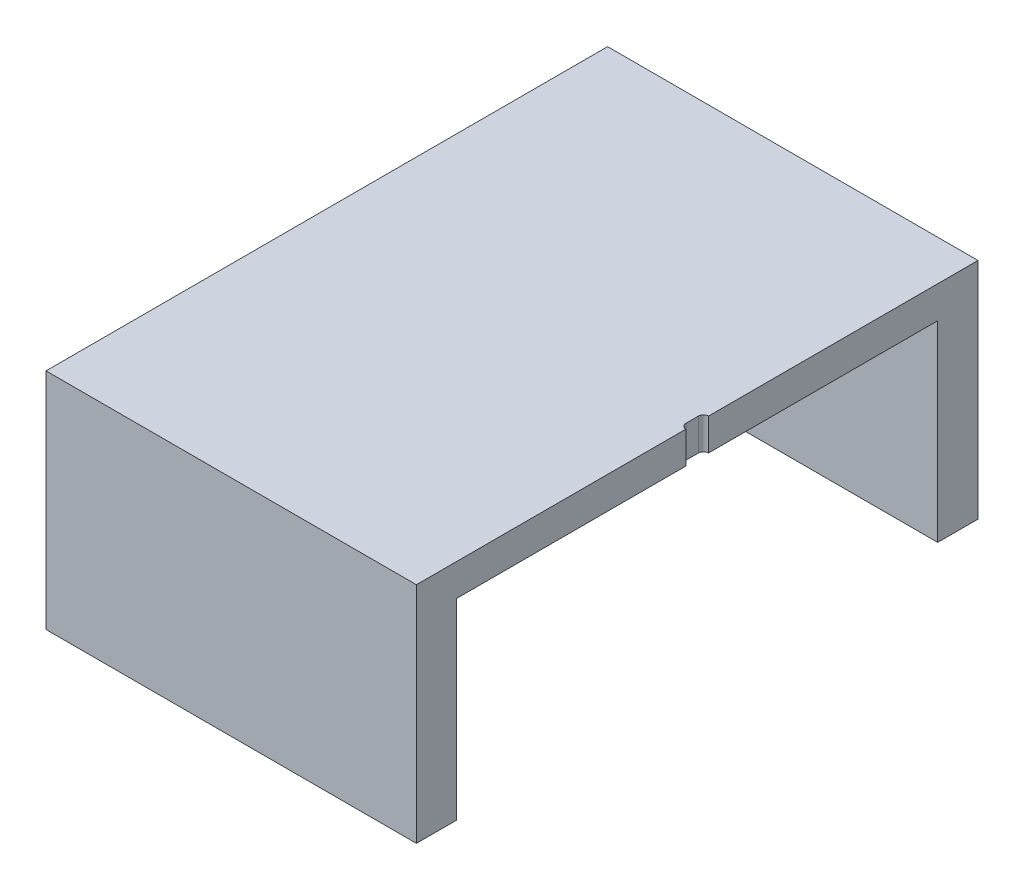
ISO-10303-21;
HEADER;
FILE_DESCRIPTION(('STEP AP214'),'2;1');
FILE_NAME('part.step','',(''),(''),'','','');
FILE_SCHEMA(('AUTOMOTIVE_DESIGN { 1 0 10303 214 1 1 1 1 }'));
ENDSEC;
DATA;
#1=APPLICATION_CONTEXT('core data for automotive mechanical design processes');
#2=APPLICATION_PROTOCOL_DEFINITION('international standard','automotive_design',2000,#1);
#3=PRODUCT_CONTEXT('',#1,'mechanical');
#4=PRODUCT('Part','Part','',(#3));
#5=PRODUCT_RELATED_PRODUCT_CATEGORY('part','',(#4));
#6=PRODUCT_DEFINITION_FORMATION('','',#4);
#7=PRODUCT_DEFINITION_CONTEXT('part definition',#1,'design');
#8=PRODUCT_DEFINITION('design','',#6,#7);
#9=PRODUCT_DEFINITION_SHAPE('','',#8);
#10=(LENGTH_UNIT() NAMED_UNIT(*) SI_UNIT(.MILLI.,.METRE.));
#11=(NAMED_UNIT(*) PLANE_ANGLE_UNIT() SI_UNIT($,.RADIAN.));
#12=(NAMED_UNIT(*) SI_UNIT($,.STERADIAN.) SOLID_ANGLE_UNIT());
#13=UNCERTAINTY_MEASURE_WITH_UNIT(LENGTH_MEASURE(1.E-05),#10,'distance_accuracy_value','');
#14=(GEOMETRIC_REPRESENTATION_CONTEXT(3) GLOBAL_UNCERTAINTY_ASSIGNED_CONTEXT((#13)) GLOBAL_UNIT_ASSIGNED_CONTEXT((#10,
#11,#12)) REPRESENTATION_CONTEXT('',''));
#15=CARTESIAN_POINT('',(0.,0.,0.));
#16=DIRECTION('',(0.,0.,1.));
#17=DIRECTION('',(1.,0.,0.));
#18=AXIS2_PLACEMENT_3D('',#15,#16,#17);
#19=CARTESIAN_POINT('',(0.,19.05,51.72));
#20=DIRECTION('',(0.,0.,-1.));
#21=DIRECTION('',(-1.,0.,0.));
#22=AXIS2_PLACEMENT_3D('',#19,#20,#21);
#23=PLANE('',#22);
#24=DIRECTION('',(1.,0.,0.));
#25=VECTOR('',#24,1.);
#26=CARTESIAN_POINT('',(0.,0.,51.72));
#27=LINE('',#26,#25);
#28=CARTESIAN_POINT('',(-32.75,0.,51.72));
#29=VERTEX_POINT('',#28);
#30=CARTESIAN_POINT('',(0.,0.,51.72));
#31=VERTEX_POINT('',#30);
#32=EDGE_CURVE('E116',#29,#31,#27,.T.);
#33=ORIENTED_EDGE('',*,*,#32,.F.);
#34=DIRECTION('',(0.,-1.,0.));
#35=VECTOR('',#34,1.);
#36=CARTESIAN_POINT('',(-32.75,19.05,51.72));
#37=LINE('',#36,#35);
#38=CARTESIAN_POINT('',(-32.75,19.05,51.72));
#39=VERTEX_POINT('',#38);
#40=EDGE_CURVE('E11',#39,#29,#37,.T.);
#41=ORIENTED_EDGE('',*,*,#40,.F.);
#42=DIRECTION('',(1.,0.,0.));
#43=VECTOR('',#42,1.);
#44=CARTESIAN_POINT('',(0.,19.05,51.72));
#45=LINE('',#44,#43);
#46=CARTESIAN_POINT('',(0.,19.05,51.72));
#47=VERTEX_POINT('',#46);
#48=EDGE_CURVE('E117',#39,#47,#45,.T.);
#49=ORIENTED_EDGE('',*,*,#48,.T.);
#50=DIRECTION('',(0.,-1.,0.));
#51=VECTOR('',#50,1.);
#52=CARTESIAN_POINT('',(0.,19.05,51.72));
#53=LINE('',#52,#51);
#54=EDGE_CURVE('E101',#47,#31,#53,.T.);
#55=ORIENTED_EDGE('',*,*,#54,.T.);
#56=EDGE_LOOP('',(#33,#41,#49,#55));
#57=FACE_BOUND('',#56,.T.);
#58=ADVANCED_FACE('F43',(#57),#23,.T.);
#59=CARTESIAN_POINT('',(-32.75,19.05,0.));
#60=DIRECTION('',(1.,0.,0.));
#61=DIRECTION('',(0.,0.,-1.));
#62=AXIS2_PLACEMENT_3D('',#59,#60,#61);
#63=PLANE('',#62);
#64=DIRECTION('',(0.,0.,1.));
#65=VECTOR('',#64,1.);
#66=CARTESIAN_POINT('',(-32.75,0.,0.));
#67=LINE('',#66,#65);
#68=CARTESIAN_POINT('',(-32.75,0.,4.));
#69=VERTEX_POINT('',#68);
#70=EDGE_CURVE('E130',#69,#29,#67,.T.);
#71=ORIENTED_EDGE('',*,*,#70,.F.);
#72=DIRECTION('',(0.,-1.,0.));
#73=VECTOR('',#72,1.);
#74=CARTESIAN_POINT('',(-32.75,19.05,4.));
#75=LINE('',#74,#73);
#76=CARTESIAN_POINT('',(-32.75,19.05,4.));
#77=VERTEX_POINT('',#76);
#78=EDGE_CURVE('E51',#77,#69,#75,.T.);
#79=ORIENTED_EDGE('',*,*,#78,.F.);
#80=DIRECTION('',(0.,0.,1.));
#81=VECTOR('',#80,1.);
#82=CARTESIAN_POINT('',(-32.75,19.05,0.));
#83=LINE('',#82,#81);
#84=EDGE_CURVE('E58',#77,#39,#83,.T.);
#85=ORIENTED_EDGE('',*,*,#84,.T.);
#86=ORIENTED_EDGE('',*,*,#40,.T.);
#87=EDGE_LOOP('',(#71,#79,#85,#86));
#88=FACE_BOUND('',#87,.T.);
#89=ADVANCED_FACE('F242',(#88),#63,.T.);
#90=CARTESIAN_POINT('',(0.,19.05,4.));
#91=DIRECTION('',(0.,0.,1.));
#92=DIRECTION('',(1.,0.,0.));
#93=AXIS2_PLACEMENT_3D('',#90,#91,#92);
#94=PLANE('',#93);
#95=DIRECTION('',(-1.,0.,0.));
#96=VECTOR('',#95,1.);
#97=CARTESIAN_POINT('',(0.,0.,4.));
#98=LINE('',#97,#96);
#99=CARTESIAN_POINT('',(0.,0.,4.));
#100=VERTEX_POINT('',#99);
#101=EDGE_CURVE('E126',#100,#69,#98,.T.);
#102=ORIENTED_EDGE('',*,*,#101,.F.);
#103=DIRECTION('',(0.,-1.,0.));
#104=VECTOR('',#103,1.);
#105=CARTESIAN_POINT('',(0.,19.05,4.));
#106=LINE('',#105,#104);
#107=CARTESIAN_POINT('',(0.,19.05,4.));
#108=VERTEX_POINT('',#107);
#109=EDGE_CURVE('E539',#108,#100,#106,.T.);
#110=ORIENTED_EDGE('',*,*,#109,.F.);
#111=DIRECTION('',(-1.,0.,0.));
#112=VECTOR('',#111,1.);
#113=CARTESIAN_POINT('',(0.,19.05,4.));
#114=LINE('',#113,#112);
#115=EDGE_CURVE('E136',#108,#77,#114,.T.);
#116=ORIENTED_EDGE('',*,*,#115,.T.);
#117=ORIENTED_EDGE('',*,*,#78,.T.);
#118=EDGE_LOOP('',(#102,#110,#116,#117));
#119=FACE_BOUND('',#118,.T.);
#120=ADVANCED_FACE('F247',(#119),#94,.T.);
#121=CARTESIAN_POINT('',(0.,19.05,0.));
#122=DIRECTION('',(1.,0.,0.));
#123=DIRECTION('',(0.,0.,-1.));
#124=AXIS2_PLACEMENT_3D('',#121,#122,#123);
#125=PLANE('',#124);
#126=DIRECTION('',(0.,0.,1.));
#127=VECTOR('',#126,1.);
#128=CARTESIAN_POINT('',(0.,0.,0.));
#129=LINE('',#128,#127);
#130=CARTESIAN_POINT('',(0.,0.,0.));
#131=VERTEX_POINT('',#130);
#132=EDGE_CURVE('E119',#131,#100,#129,.T.);
#133=ORIENTED_EDGE('',*,*,#132,.F.);
#134=DIRECTION('',(0.,-1.,0.));
#135=VECTOR('',#134,1.);
#136=CARTESIAN_POINT('',(0.,19.05,0.));
#137=LINE('',#136,#135);
#138=CARTESIAN_POINT('',(0.,22.225,0.));
#139=VERTEX_POINT('',#138);
#140=EDGE_CURVE('E540',#139,#131,#137,.T.);
#141=ORIENTED_EDGE('',*,*,#140,.F.);
#142=DIRECTION('',(0.,0.,-1.));
#143=VECTOR('',#142,1.);
#144=CARTESIAN_POINT('',(0.,22.225,0.));
#145=LINE('',#144,#143);
#146=CARTESIAN_POINT('',(0.,22.225,26.735));
#147=VERTEX_POINT('',#146);
#148=EDGE_CURVE('E155',#147,#139,#145,.T.);
#149=ORIENTED_EDGE('',*,*,#148,.F.);
#150=DIRECTION('',(0.,-1.,0.));
#151=VECTOR('',#150,1.);
#152=CARTESIAN_POINT('',(0.,22.225,26.735));
#153=LINE('',#152,#151);
#154=CARTESIAN_POINT('',(0.,19.05,26.735));
#155=VERTEX_POINT('',#154);
#156=EDGE_CURVE('E148',#147,#155,#153,.T.);
#157=ORIENTED_EDGE('',*,*,#156,.T.);
#158=DIRECTION('',(0.,0.,-1.));
#159=VECTOR('',#158,1.);
#160=CARTESIAN_POINT('',(0.,19.05,0.));
#161=LINE('',#160,#159);
#162=EDGE_CURVE('E165',#155,#108,#161,.T.);
#163=ORIENTED_EDGE('',*,*,#162,.T.);
#164=ORIENTED_EDGE('',*,*,#109,.T.);
#165=EDGE_LOOP('',(#133,#141,#149,#157,#163,#164));
#166=FACE_BOUND('',#165,.T.);
#167=ADVANCED_FACE('F470',(#166),#125,.T.);
#168=CARTESIAN_POINT('',(0.,19.05,0.));
#169=DIRECTION('',(0.,0.,1.));
#170=DIRECTION('',(1.,0.,0.));
#171=AXIS2_PLACEMENT_3D('',#168,#169,#170);
#172=PLANE('',#171);
#173=DIRECTION('',(-1.,0.,0.));
#174=VECTOR('',#173,1.);
#175=CARTESIAN_POINT('',(0.,0.,0.));
#176=LINE('',#175,#174);
#177=CARTESIAN_POINT('',(-36.75,0.,0.));
#178=VERTEX_POINT('',#177);
#179=EDGE_CURVE('E125',#131,#178,#176,.T.);
#180=ORIENTED_EDGE('',*,*,#179,.T.);
#181=DIRECTION('',(0.,-1.,0.));
#182=VECTOR('',#181,1.);
#183=CARTESIAN_POINT('',(-36.75,19.05,0.));
#184=LINE('',#183,#182);
#185=CARTESIAN_POINT('',(-36.75,22.225,0.));
#186=VERTEX_POINT('',#185);
#187=EDGE_CURVE('E544',#186,#178,#184,.T.);
#188=ORIENTED_EDGE('',*,*,#187,.F.);
#189=DIRECTION('',(1.,0.,0.));
#190=VECTOR('',#189,1.);
#191=CARTESIAN_POINT('',(0.,22.225,0.));
#192=LINE('',#191,#190);
#193=EDGE_CURVE('E183',#186,#139,#192,.T.);
#194=ORIENTED_EDGE('',*,*,#193,.T.);
#195=ORIENTED_EDGE('',*,*,#140,.T.);
#196=EDGE_LOOP('',(#180,#188,#194,#195));
#197=FACE_BOUND('',#196,.T.);
#198=ADVANCED_FACE('F490',(#197),#172,.F.);
#199=CARTESIAN_POINT('',(-36.75,19.05,0.));
#200=DIRECTION('',(1.,0.,0.));
#201=DIRECTION('',(0.,0.,-1.));
#202=AXIS2_PLACEMENT_3D('',#199,#200,#201);
#203=PLANE('',#202);
#204=DIRECTION('',(0.,0.,1.));
#205=VECTOR('',#204,1.);
#206=CARTESIAN_POINT('',(-36.75,0.,0.));
#207=LINE('',#206,#205);
#208=CARTESIAN_POINT('',(-36.75,0.,55.72));
#209=VERTEX_POINT('',#208);
#210=EDGE_CURVE('E110',#178,#209,#207,.T.);
#211=ORIENTED_EDGE('',*,*,#210,.T.);
#212=DIRECTION('',(0.,-1.,0.));
#213=VECTOR('',#212,1.);
#214=CARTESIAN_POINT('',(-36.75,19.05,55.72));
#215=LINE('',#214,#213);
#216=CARTESIAN_POINT('',(-36.75,22.225,55.72));
#217=VERTEX_POINT('',#216);
#218=EDGE_CURVE('E100',#217,#209,#215,.T.);
#219=ORIENTED_EDGE('',*,*,#218,.F.);
#220=DIRECTION('',(0.,0.,-1.));
#221=VECTOR('',#220,1.);
#222=CARTESIAN_POINT('',(-36.75,22.225,0.));
#223=LINE('',#222,#221);
#224=EDGE_CURVE('E180',#217,#186,#223,.T.);
#225=ORIENTED_EDGE('',*,*,#224,.T.);
#226=ORIENTED_EDGE('',*,*,#187,.T.);
#227=EDGE_LOOP('',(#211,#219,#225,#226));
#228=FACE_BOUND('',#227,.T.);
#229=ADVANCED_FACE('F479',(#228),#203,.F.);
#230=CARTESIAN_POINT('',(0.,19.05,55.72));
#231=DIRECTION('',(0.,0.,1.));
#232=DIRECTION('',(1.,0.,0.));
#233=AXIS2_PLACEMENT_3D('',#230,#231,#232);
#234=PLANE('',#233);
#235=DIRECTION('',(-1.,0.,0.));
#236=VECTOR('',#235,1.);
#237=CARTESIAN_POINT('',(0.,0.,55.72));
#238=LINE('',#237,#236);
#239=CARTESIAN_POINT('',(0.,0.,55.72));
#240=VERTEX_POINT('',#239);
#241=EDGE_CURVE('E104',#240,#209,#238,.T.);
#242=ORIENTED_EDGE('',*,*,#241,.F.);
#243=DIRECTION('',(0.,-1.,0.));
#244=VECTOR('',#243,1.);
#245=CARTESIAN_POINT('',(0.,19.05,55.72));
#246=LINE('',#245,#244);
#247=CARTESIAN_POINT('',(0.,22.225,55.72));
#248=VERTEX_POINT('',#247);
#249=EDGE_CURVE('E87',#248,#240,#246,.T.);
#250=ORIENTED_EDGE('',*,*,#249,.F.);
#251=DIRECTION('',(1.,0.,0.));
#252=VECTOR('',#251,1.);
#253=CARTESIAN_POINT('',(0.,22.225,55.72));
#254=LINE('',#253,#252);
#255=EDGE_CURVE('E178',#217,#248,#254,.T.);
#256=ORIENTED_EDGE('',*,*,#255,.F.);
#257=ORIENTED_EDGE('',*,*,#218,.T.);
#258=EDGE_LOOP('',(#242,#250,#256,#257));
#259=FACE_BOUND('',#258,.T.);
#260=ADVANCED_FACE('F105',(#259),#234,.T.);
#261=EDGE_CURVE('E92',#31,#240,#129,.T.);
#262=ORIENTED_EDGE('',*,*,#261,.F.);
#263=ORIENTED_EDGE('',*,*,#54,.F.);
#264=DIRECTION('',(0.,0.,-1.));
#265=VECTOR('',#264,1.);
#266=CARTESIAN_POINT('',(0.,19.05,0.));
#267=LINE('',#266,#265);
#268=CARTESIAN_POINT('',(0.,19.05,28.985));
#269=VERTEX_POINT('',#268);
#270=EDGE_CURVE('E162',#47,#269,#267,.T.);
#271=ORIENTED_EDGE('',*,*,#270,.T.);
#272=DIRECTION('',(0.,-1.,0.));
#273=VECTOR('',#272,1.);
#274=CARTESIAN_POINT('',(0.,22.225,28.985));
#275=LINE('',#274,#273);
#276=CARTESIAN_POINT('',(0.,22.225,28.985));
#277=VERTEX_POINT('',#276);
#278=EDGE_CURVE('E135',#277,#269,#275,.T.);
#279=ORIENTED_EDGE('',*,*,#278,.F.);
#280=DIRECTION('',(0.,0.,-1.));
#281=VECTOR('',#280,1.);
#282=CARTESIAN_POINT('',(0.,22.225,0.));
#283=LINE('',#282,#281);
#284=EDGE_CURVE('E96',#248,#277,#283,.T.);
#285=ORIENTED_EDGE('',*,*,#284,.F.);
#286=ORIENTED_EDGE('',*,*,#249,.T.);
#287=EDGE_LOOP('',(#262,#263,#271,#279,#285,#286));
#288=FACE_BOUND('',#287,.T.);
#289=ADVANCED_FACE('F89',(#288),#125,.T.);
#290=CARTESIAN_POINT('',(0.,0.,0.));
#291=DIRECTION('',(0.,1.,0.));
#292=DIRECTION('',(0.,0.,1.));
#293=AXIS2_PLACEMENT_3D('',#290,#291,#292);
#294=PLANE('',#293);
#295=CARTESIAN_POINT('',(-9.99999999999999,0.,53.22));
#296=DIRECTION('',(0.,-1.,0.));
#297=DIRECTION('',(0.,0.,-1.));
#298=AXIS2_PLACEMENT_3D('',#295,#296,#297);
#299=CIRCLE('',#298,0.888999999999989);
#300=CARTESIAN_POINT('',(-9.99999999999999,0.,52.331));
#301=VERTEX_POINT('',#300);
#302=EDGE_CURVE('E208',#301,#301,#299,.T.);
#303=ORIENTED_EDGE('',*,*,#302,.F.);
#304=EDGE_LOOP('',(#303));
#305=FACE_BOUND('',#304,.T.);
#306=CARTESIAN_POINT('',(-34.25,0.,53.22));
#307=DIRECTION('',(0.,-1.,0.));
#308=DIRECTION('',(0.,0.,-1.));
#309=AXIS2_PLACEMENT_3D('',#306,#307,#308);
#310=CIRCLE('',#309,0.888999999999987);
#311=CARTESIAN_POINT('',(-34.25,0.,52.331));
#312=VERTEX_POINT('',#311);
#313=EDGE_CURVE('E202',#312,#312,#310,.T.);
#314=ORIENTED_EDGE('',*,*,#313,.F.);
#315=EDGE_LOOP('',(#314));
#316=FACE_BOUND('',#315,.T.);
#317=CARTESIAN_POINT('',(-34.25,0.,2.5));
#318=DIRECTION('',(0.,-1.,0.));
#319=DIRECTION('',(0.,0.,-1.));
#320=AXIS2_PLACEMENT_3D('',#317,#318,#319);
#321=CIRCLE('',#320,0.888999999999987);
#322=CARTESIAN_POINT('',(-34.25,0.,1.61100000000002));
#323=VERTEX_POINT('',#322);
#324=EDGE_CURVE('E196',#323,#323,#321,.T.);
#325=ORIENTED_EDGE('',*,*,#324,.F.);
#326=EDGE_LOOP('',(#325));
#327=FACE_BOUND('',#326,.T.);
#328=CARTESIAN_POINT('',(-10.,0.,2.5));
#329=DIRECTION('',(0.,-1.,0.));
#330=DIRECTION('',(0.,0.,-1.));
#331=AXIS2_PLACEMENT_3D('',#328,#329,#330);
#332=CIRCLE('',#331,0.888999999999989);
#333=CARTESIAN_POINT('',(-10.,0.,1.61100000000002));
#334=VERTEX_POINT('',#333);
#335=EDGE_CURVE('E190',#334,#334,#332,.T.);
#336=ORIENTED_EDGE('',*,*,#335,.F.);
#337=EDGE_LOOP('',(#336));
#338=FACE_BOUND('',#337,.T.);
#339=ORIENTED_EDGE('',*,*,#32,.T.);
#340=ORIENTED_EDGE('',*,*,#261,.T.);
#341=ORIENTED_EDGE('',*,*,#241,.T.);
#342=ORIENTED_EDGE('',*,*,#210,.F.);
#343=ORIENTED_EDGE('',*,*,#179,.F.);
#344=ORIENTED_EDGE('',*,*,#132,.T.);
#345=ORIENTED_EDGE('',*,*,#101,.T.);
#346=ORIENTED_EDGE('',*,*,#70,.T.);
#347=EDGE_LOOP('',(#339,#340,#341,#342,#343,#344,#345,#346));
#348=FACE_BOUND('',#347,.T.);
#349=ADVANCED_FACE('F113',(#305,#316,#327,#338,#348),#294,.F.);
#350=CARTESIAN_POINT('',(0.,22.225,28.485));
#351=DIRECTION('',(0.,-1.,0.));
#352=DIRECTION('',(0.,0.,-1.));
#353=AXIS2_PLACEMENT_3D('',#350,#351,#352);
#354=CYLINDRICAL_SURFACE('',#353,0.499999999999993);
#355=CARTESIAN_POINT('',(0.,19.05,28.485));
#356=DIRECTION('',(0.,1.,0.));
#357=DIRECTION('',(0.,0.,1.));
#358=AXIS2_PLACEMENT_3D('',#355,#356,#357);
#359=CIRCLE('',#358,0.499999999999993);
#360=CARTESIAN_POINT('',(-0.49999999999999,19.05,28.485));
#361=VERTEX_POINT('',#360);
#362=EDGE_CURVE('E159',#361,#269,#359,.T.);
#363=ORIENTED_EDGE('',*,*,#362,.F.);
#364=DIRECTION('',(0.,-1.,0.));
#365=VECTOR('',#364,1.);
#366=CARTESIAN_POINT('',(-0.49999999999999,22.225,28.485));
#367=LINE('',#366,#365);
#368=CARTESIAN_POINT('',(-0.49999999999999,22.225,28.485));
#369=VERTEX_POINT('',#368);
#370=EDGE_CURVE('E142',#369,#361,#367,.T.);
#371=ORIENTED_EDGE('',*,*,#370,.F.);
#372=CARTESIAN_POINT('',(0.,22.225,28.485));
#373=DIRECTION('',(0.,1.,0.));
#374=DIRECTION('',(0.,0.,1.));
#375=AXIS2_PLACEMENT_3D('',#372,#373,#374);
#376=CIRCLE('',#375,0.499999999999993);
#377=EDGE_CURVE('E174',#369,#277,#376,.T.);
#378=ORIENTED_EDGE('',*,*,#377,.T.);
#379=ORIENTED_EDGE('',*,*,#278,.T.);
#380=EDGE_LOOP('',(#363,#371,#378,#379));
#381=FACE_BOUND('',#380,.T.);
#382=ADVANCED_FACE('F216',(#381),#354,.F.);
#383=CARTESIAN_POINT('',(-0.499999999999992,22.225,0.));
#384=DIRECTION('',(-1.,0.,0.));
#385=DIRECTION('',(0.,0.,1.));
#386=AXIS2_PLACEMENT_3D('',#383,#384,#385);
#387=PLANE('',#386);
#388=DIRECTION('',(0.,0.,-1.));
#389=VECTOR('',#388,1.);
#390=CARTESIAN_POINT('',(-0.499999999999992,19.05,0.));
#391=LINE('',#390,#389);
#392=CARTESIAN_POINT('',(-0.499999999999997,19.05,27.235));
#393=VERTEX_POINT('',#392);
#394=EDGE_CURVE('E156',#361,#393,#391,.T.);
#395=ORIENTED_EDGE('',*,*,#394,.T.);
#396=DIRECTION('',(0.,-1.,0.));
#397=VECTOR('',#396,1.);
#398=CARTESIAN_POINT('',(-0.499999999999997,22.225,27.235));
#399=LINE('',#398,#397);
#400=CARTESIAN_POINT('',(-0.499999999999997,22.225,27.235));
#401=VERTEX_POINT('',#400);
#402=EDGE_CURVE('E145',#401,#393,#399,.T.);
#403=ORIENTED_EDGE('',*,*,#402,.F.);
#404=DIRECTION('',(0.,0.,-1.));
#405=VECTOR('',#404,1.);
#406=CARTESIAN_POINT('',(-0.499999999999992,22.225,0.));
#407=LINE('',#406,#405);
#408=EDGE_CURVE('E171',#369,#401,#407,.T.);
#409=ORIENTED_EDGE('',*,*,#408,.F.);
#410=ORIENTED_EDGE('',*,*,#370,.T.);
#411=EDGE_LOOP('',(#395,#403,#409,#410));
#412=FACE_BOUND('',#411,.T.);
#413=ADVANCED_FACE('F399',(#412),#387,.F.);
#414=CARTESIAN_POINT('',(0.,22.225,27.235));
#415=DIRECTION('',(0.,-1.,0.));
#416=DIRECTION('',(0.,0.,-1.));
#417=AXIS2_PLACEMENT_3D('',#414,#415,#416);
#418=CYLINDRICAL_SURFACE('',#417,0.499999999999993);
#419=CARTESIAN_POINT('',(0.,19.05,27.235));
#420=DIRECTION('',(0.,1.,0.));
#421=DIRECTION('',(0.,0.,1.));
#422=AXIS2_PLACEMENT_3D('',#419,#420,#421);
#423=CIRCLE('',#422,0.499999999999993);
#424=EDGE_CURVE('E152',#155,#393,#423,.T.);
#425=ORIENTED_EDGE('',*,*,#424,.F.);
#426=ORIENTED_EDGE('',*,*,#156,.F.);
#427=CARTESIAN_POINT('',(0.,22.225,27.235));
#428=DIRECTION('',(0.,1.,0.));
#429=DIRECTION('',(0.,0.,1.));
#430=AXIS2_PLACEMENT_3D('',#427,#428,#429);
#431=CIRCLE('',#430,0.499999999999993);
#432=EDGE_CURVE('E151',#147,#401,#431,.T.);
#433=ORIENTED_EDGE('',*,*,#432,.T.);
#434=ORIENTED_EDGE('',*,*,#402,.T.);
#435=EDGE_LOOP('',(#425,#426,#433,#434));
#436=FACE_BOUND('',#435,.T.);
#437=ADVANCED_FACE('F407',(#436),#418,.F.);
#438=CARTESIAN_POINT('',(0.,22.225,28.485));
#439=DIRECTION('',(0.,1.,0.));
#440=DIRECTION('',(0.,0.,1.));
#441=AXIS2_PLACEMENT_3D('',#438,#439,#440);
#442=PLANE('',#441);
#443=ORIENTED_EDGE('',*,*,#148,.T.);
#444=ORIENTED_EDGE('',*,*,#193,.F.);
#445=ORIENTED_EDGE('',*,*,#224,.F.);
#446=ORIENTED_EDGE('',*,*,#255,.T.);
#447=ORIENTED_EDGE('',*,*,#284,.T.);
#448=ORIENTED_EDGE('',*,*,#377,.F.);
#449=ORIENTED_EDGE('',*,*,#408,.T.);
#450=ORIENTED_EDGE('',*,*,#432,.F.);
#451=EDGE_LOOP('',(#443,#444,#445,#446,#447,#448,#449,#450));
#452=FACE_BOUND('',#451,.T.);
#453=ADVANCED_FACE('F415',(#452),#442,.T.);
#454=CARTESIAN_POINT('',(0.,19.05,28.485));
#455=DIRECTION('',(0.,1.,0.));
#456=DIRECTION('',(0.,0.,1.));
#457=AXIS2_PLACEMENT_3D('',#454,#455,#456);
#458=PLANE('',#457);
#459=ORIENTED_EDGE('',*,*,#48,.F.);
#460=ORIENTED_EDGE('',*,*,#84,.F.);
#461=ORIENTED_EDGE('',*,*,#115,.F.);
#462=ORIENTED_EDGE('',*,*,#162,.F.);
#463=ORIENTED_EDGE('',*,*,#424,.T.);
#464=ORIENTED_EDGE('',*,*,#394,.F.);
#465=ORIENTED_EDGE('',*,*,#362,.T.);
#466=ORIENTED_EDGE('',*,*,#270,.F.);
#467=EDGE_LOOP('',(#459,#460,#461,#462,#463,#464,#465,#466));
#468=FACE_BOUND('',#467,.T.);
#469=ADVANCED_FACE('F237',(#468),#458,.F.);
#470=CARTESIAN_POINT('',(-10.,5.73,2.5));
#471=DIRECTION('',(0.,-1.,0.));
#472=DIRECTION('',(0.,0.,-1.));
#473=AXIS2_PLACEMENT_3D('',#470,#471,#472);
#474=CONICAL_SURFACE('',#473,0.888999999999999,1.02974425867665);
#475=CARTESIAN_POINT('',(-10.,6.2641650903155,2.5));
#476=VERTEX_POINT('',#475);
#477=VERTEX_LOOP('',#476);
#478=FACE_BOUND('',#477,.T.);
#479=CARTESIAN_POINT('',(-10.,5.73,2.5));
#480=DIRECTION('',(0.,-1.,0.));
#481=DIRECTION('',(0.,0.,-1.));
#482=AXIS2_PLACEMENT_3D('',#479,#480,#481);
#483=CIRCLE('',#482,0.888999999999999);
#484=CARTESIAN_POINT('',(-10.,5.73,1.611));
#485=VERTEX_POINT('',#484);
#486=EDGE_CURVE('E168',#485,#485,#483,.T.);
#487=ORIENTED_EDGE('',*,*,#486,.T.);
#488=EDGE_LOOP('',(#487));
#489=FACE_BOUND('',#488,.T.);
#490=ADVANCED_FACE('F227',(#478,#489),#474,.F.);
#491=CARTESIAN_POINT('',(-10.,0.,2.5));
#492=DIRECTION('',(0.,-1.,0.));
#493=DIRECTION('',(0.,0.,-1.));
#494=AXIS2_PLACEMENT_3D('',#491,#492,#493);
#495=CYLINDRICAL_SURFACE('',#494,0.888999999999994);
#496=ORIENTED_EDGE('',*,*,#486,.F.);
#497=EDGE_LOOP('',(#496));
#498=FACE_BOUND('',#497,.T.);
#499=ORIENTED_EDGE('',*,*,#335,.T.);
#500=EDGE_LOOP('',(#499));
#501=FACE_BOUND('',#500,.T.);
#502=ADVANCED_FACE('F224',(#498,#501),#495,.F.);
#503=CARTESIAN_POINT('',(-34.25,5.73,2.5));
#504=DIRECTION('',(0.,-1.,0.));
#505=DIRECTION('',(0.,0.,-1.));
#506=AXIS2_PLACEMENT_3D('',#503,#504,#505);
#507=CONICAL_SURFACE('',#506,0.889000000000001,1.02974425867665);
#508=CARTESIAN_POINT('',(-34.25,6.2641650903155,2.5));
#509=VERTEX_POINT('',#508);
#510=VERTEX_LOOP('',#509);
#511=FACE_BOUND('',#510,.T.);
#512=CARTESIAN_POINT('',(-34.25,5.73,2.5));
#513=DIRECTION('',(0.,-1.,0.));
#514=DIRECTION('',(0.,0.,-1.));
#515=AXIS2_PLACEMENT_3D('',#512,#513,#514);
#516=CIRCLE('',#515,0.889000000000001);
#517=CARTESIAN_POINT('',(-34.25,5.73,1.611));
#518=VERTEX_POINT('',#517);
#519=EDGE_CURVE('E193',#518,#518,#516,.T.);
#520=ORIENTED_EDGE('',*,*,#519,.T.);
#521=EDGE_LOOP('',(#520));
#522=FACE_BOUND('',#521,.T.);
#523=ADVANCED_FACE('F226',(#511,#522),#507,.F.);
#524=CARTESIAN_POINT('',(-34.25,0.,2.5));
#525=DIRECTION('',(0.,-1.,0.));
#526=DIRECTION('',(0.,0.,-1.));
#527=AXIS2_PLACEMENT_3D('',#524,#525,#526);
#528=CYLINDRICAL_SURFACE('',#527,0.888999999999994);
#529=ORIENTED_EDGE('',*,*,#519,.F.);
#530=EDGE_LOOP('',(#529));
#531=FACE_BOUND('',#530,.T.);
#532=ORIENTED_EDGE('',*,*,#324,.T.);
#533=EDGE_LOOP('',(#532));
#534=FACE_BOUND('',#533,.T.);
#535=ADVANCED_FACE('F234',(#531,#534),#528,.F.);
#536=CARTESIAN_POINT('',(-34.25,5.73,53.22));
#537=DIRECTION('',(0.,-1.,0.));
#538=DIRECTION('',(0.,0.,-1.));
#539=AXIS2_PLACEMENT_3D('',#536,#537,#538);
#540=CONICAL_SURFACE('',#539,0.889000000000001,1.02974425867665);
#541=CARTESIAN_POINT('',(-34.25,6.2641650903155,53.22));
#542=VERTEX_POINT('',#541);
#543=VERTEX_LOOP('',#542);
#544=FACE_BOUND('',#543,.T.);
#545=CARTESIAN_POINT('',(-34.25,5.73,53.22));
#546=DIRECTION('',(0.,-1.,0.));
#547=DIRECTION('',(0.,0.,-1.));
#548=AXIS2_PLACEMENT_3D('',#545,#546,#547);
#549=CIRCLE('',#548,0.889000000000001);
#550=CARTESIAN_POINT('',(-34.25,5.73,52.331));
#551=VERTEX_POINT('',#550);
#552=EDGE_CURVE('E199',#551,#551,#549,.T.);
#553=ORIENTED_EDGE('',*,*,#552,.T.);
#554=EDGE_LOOP('',(#553));
#555=FACE_BOUND('',#554,.T.);
#556=ADVANCED_FACE('F309',(#544,#555),#540,.F.);
#557=CARTESIAN_POINT('',(-34.25,0.,53.22));
#558=DIRECTION('',(0.,-1.,0.));
#559=DIRECTION('',(0.,0.,-1.));
#560=AXIS2_PLACEMENT_3D('',#557,#558,#559);
#561=CYLINDRICAL_SURFACE('',#560,0.888999999999994);
#562=ORIENTED_EDGE('',*,*,#552,.F.);
#563=EDGE_LOOP('',(#562));
#564=FACE_BOUND('',#563,.T.);
#565=ORIENTED_EDGE('',*,*,#313,.T.);
#566=EDGE_LOOP('',(#565));
#567=FACE_BOUND('',#566,.T.);
#568=ADVANCED_FACE('F298',(#564,#567),#561,.F.);
#569=CARTESIAN_POINT('',(-9.99999999999999,5.73,53.22));
#570=DIRECTION('',(0.,-1.,0.));
#571=DIRECTION('',(0.,0.,-1.));
#572=AXIS2_PLACEMENT_3D('',#569,#570,#571);
#573=CONICAL_SURFACE('',#572,0.888999999999999,1.02974425867665);
#574=CARTESIAN_POINT('',(-9.99999999999999,6.2641650903155,53.22));
#575=VERTEX_POINT('',#574);
#576=VERTEX_LOOP('',#575);
#577=FACE_BOUND('',#576,.T.);
#578=CARTESIAN_POINT('',(-9.99999999999999,5.73,53.22));
#579=DIRECTION('',(0.,-1.,0.));
#580=DIRECTION('',(0.,0.,-1.));
#581=AXIS2_PLACEMENT_3D('',#578,#579,#580);
#582=CIRCLE('',#581,0.888999999999999);
#583=CARTESIAN_POINT('',(-9.99999999999999,5.73,52.331));
#584=VERTEX_POINT('',#583);
#585=EDGE_CURVE('E205',#584,#584,#582,.T.);
#586=ORIENTED_EDGE('',*,*,#585,.T.);
#587=EDGE_LOOP('',(#586));
#588=FACE_BOUND('',#587,.T.);
#589=ADVANCED_FACE('F295',(#577,#588),#573,.F.);
#590=CARTESIAN_POINT('',(-9.99999999999999,0.,53.22));
#591=DIRECTION('',(0.,-1.,0.));
#592=DIRECTION('',(0.,0.,-1.));
#593=AXIS2_PLACEMENT_3D('',#590,#591,#592);
#594=CYLINDRICAL_SURFACE('',#593,0.888999999999994);
#595=ORIENTED_EDGE('',*,*,#585,.F.);
#596=EDGE_LOOP('',(#595));
#597=FACE_BOUND('',#596,.T.);
#598=ORIENTED_EDGE('',*,*,#302,.T.);
#599=EDGE_LOOP('',(#598));
#600=FACE_BOUND('',#599,.T.);
#601=ADVANCED_FACE('F212',(#597,#600),#594,.F.);
#602=CLOSED_SHELL('',(#58,#89,#120,#167,#198,#229,#260,#289,#349,#382,#413,#437,#453,#469,#490,
#502,#523,#535,#556,#568,#589,#601));
#603=MANIFOLD_SOLID_BREP('B2',#602);
#604=ADVANCED_BREP_SHAPE_REPRESENTATION('',(#18,#603),#14);
#605=SHAPE_DEFINITION_REPRESENTATION(#9,#604);
ENDSEC;
END-ISO-10303-21;
